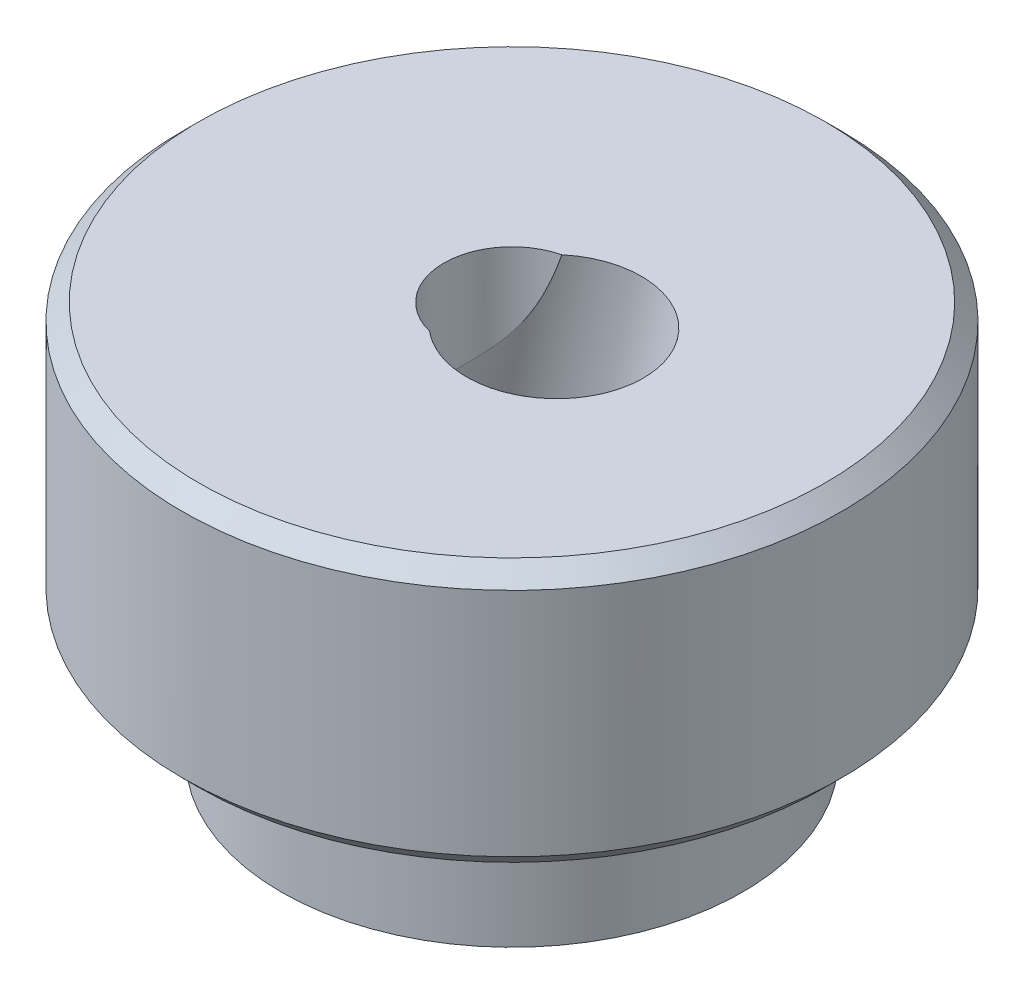
ISO-10303-21;
HEADER;
FILE_DESCRIPTION(('STEP AP214'),'2;1');
FILE_NAME('part.step','',(''),(''),'','','');
FILE_SCHEMA(('AUTOMOTIVE_DESIGN { 1 0 10303 214 1 1 1 1 }'));
ENDSEC;
DATA;
#1=APPLICATION_CONTEXT('core data for automotive mechanical design processes');
#2=APPLICATION_PROTOCOL_DEFINITION('international standard','automotive_design',2000,#1);
#3=PRODUCT_CONTEXT('',#1,'mechanical');
#4=PRODUCT('Part','Part','',(#3));
#5=PRODUCT_RELATED_PRODUCT_CATEGORY('part','',(#4));
#6=PRODUCT_DEFINITION_FORMATION('','',#4);
#7=PRODUCT_DEFINITION_CONTEXT('part definition',#1,'design');
#8=PRODUCT_DEFINITION('design','',#6,#7);
#9=PRODUCT_DEFINITION_SHAPE('','',#8);
#10=(LENGTH_UNIT() NAMED_UNIT(*) SI_UNIT(.MILLI.,.METRE.));
#11=(NAMED_UNIT(*) PLANE_ANGLE_UNIT() SI_UNIT($,.RADIAN.));
#12=(NAMED_UNIT(*) SI_UNIT($,.STERADIAN.) SOLID_ANGLE_UNIT());
#13=UNCERTAINTY_MEASURE_WITH_UNIT(LENGTH_MEASURE(1.E-05),#10,'distance_accuracy_value','');
#14=(GEOMETRIC_REPRESENTATION_CONTEXT(3) GLOBAL_UNCERTAINTY_ASSIGNED_CONTEXT((#13)) GLOBAL_UNIT_ASSIGNED_CONTEXT((#10,
#11,#12)) REPRESENTATION_CONTEXT('',''));
#15=CARTESIAN_POINT('',(0.,0.,0.));
#16=DIRECTION('',(0.,0.,1.));
#17=DIRECTION('',(1.,0.,0.));
#18=AXIS2_PLACEMENT_3D('',#15,#16,#17);
#19=CARTESIAN_POINT('',(7.00000000000014,0.,0.));
#20=DIRECTION('',(0.,1.,0.));
#21=DIRECTION('',(0.,0.,0.999999999999999));
#22=AXIS2_PLACEMENT_3D('',#19,#20,#21);
#23=PLANE('',#22);
#24=CARTESIAN_POINT('',(0.,0.,0.));
#25=DIRECTION('',(0.,-1.,0.));
#26=DIRECTION('',(0.,0.,-0.999999999999999));
#27=AXIS2_PLACEMENT_3D('',#24,#25,#26);
#28=CIRCLE('',#27,7.);
#29=CARTESIAN_POINT('',(0.,0.,-6.99999999999999));
#30=VERTEX_POINT('',#29);
#31=EDGE_CURVE('E48',#30,#30,#28,.F.);
#32=ORIENTED_EDGE('',*,*,#31,.F.);
#33=EDGE_LOOP('',(#32));
#34=FACE_BOUND('',#33,.T.);
#35=CARTESIAN_POINT('',(-1.27533937002003,0.,0.));
#36=DIRECTION('',(0.,1.,0.));
#37=DIRECTION('',(-1.,0.,0.));
#38=AXIS2_PLACEMENT_3D('',#35,#36,#37);
#39=ELLIPSE('',#38,2.70920257639233,2.65);
#40=CARTESIAN_POINT('',(0.493504047246851,0.,-2.0072226471797));
#41=VERTEX_POINT('',#40);
#42=CARTESIAN_POINT('',(0.493504047246768,0.,2.00722264717969));
#43=VERTEX_POINT('',#42);
#44=EDGE_CURVE('E42',#41,#43,#39,.T.);
#45=ORIENTED_EDGE('',*,*,#44,.T.);
#46=CARTESIAN_POINT('',(0.,0.,0.));
#47=DIRECTION('',(0.,-1.,0.));
#48=DIRECTION('',(0.,0.,-0.999999999999999));
#49=AXIS2_PLACEMENT_3D('',#46,#47,#48);
#50=CIRCLE('',#49,2.067);
#51=EDGE_CURVE('E19',#43,#41,#50,.F.);
#52=ORIENTED_EDGE('',*,*,#51,.T.);
#53=EDGE_LOOP('',(#45,#52));
#54=FACE_BOUND('',#53,.T.);
#55=ADVANCED_FACE('F16',(#34,#54),#23,.F.);
#56=CARTESIAN_POINT('',(0.,0.,0.));
#57=DIRECTION('',(0.,-1.,0.));
#58=DIRECTION('',(0.,0.,-0.999999999999999));
#59=AXIS2_PLACEMENT_3D('',#56,#57,#58);
#60=CYLINDRICAL_SURFACE('',#59,2.067);
#61=ORIENTED_EDGE('',*,*,#51,.F.);
#62=CARTESIAN_POINT('',(0.493504047246768,0.,2.00722264717969));
#63=CARTESIAN_POINT('',(0.517814431621046,0.0810077464212896,2.00123652872899));
#64=CARTESIAN_POINT('',(0.542731216709212,0.161797541343417,1.99465048664308));
#65=CARTESIAN_POINT('',(0.593931080497523,0.322843219694935,1.98001362872107));
#66=CARTESIAN_POINT('',(0.620214689850672,0.403098881906635,1.97196224090358));
#67=CARTESIAN_POINT('',(0.674571081727248,0.563766520293689,1.95403901411044));
#68=CARTESIAN_POINT('',(0.702659950013667,0.644171042963227,1.94414868414269));
#69=CARTESIAN_POINT('',(0.760527000887971,0.804073064003856,1.92225015042273));
#70=CARTESIAN_POINT('',(0.790304991198076,0.883570664380106,1.9102421874001));
#71=CARTESIAN_POINT('',(0.853152166971147,1.04512616149383,1.88304229241717));
#72=CARTESIAN_POINT('',(0.886310213484248,1.12712923342833,1.86772742876976));
#73=CARTESIAN_POINT('',(0.954810263405579,1.28948820673061,1.83365493324396));
#74=CARTESIAN_POINT('',(0.990151866670788,1.36984440631936,1.81489793091341));
#75=CARTESIAN_POINT('',(1.06296962145623,1.52806900085759,1.77322806723388));
#76=CARTESIAN_POINT('',(1.1004361116363,1.60594648129435,1.75033312049722));
#77=CARTESIAN_POINT('',(1.17759447283828,1.75883171356853,1.69938174516717));
#78=CARTESIAN_POINT('',(1.21728484424599,1.83384134318662,1.67132876631152));
#79=CARTESIAN_POINT('',(1.28732960200999,1.95977002673956,1.61760244082733));
#80=CARTESIAN_POINT('',(1.31721350844364,2.0115913563641,1.59343399672277));
#81=CARTESIAN_POINT('',(1.3778011995899,2.1128615352028,1.54134697348767));
#82=CARTESIAN_POINT('',(1.40850525965676,2.16230957163189,1.51342712187065));
#83=CARTESIAN_POINT('',(1.47008914423938,2.25787394367778,1.45366749180922));
#84=CARTESIAN_POINT('',(1.50096479634901,2.30401660318189,1.42186587940412));
#85=CARTESIAN_POINT('',(1.56264096353294,2.3928988117781,1.35379183499073));
#86=CARTESIAN_POINT('',(1.59344150267897,2.43563964596191,1.31752110458125));
#87=CARTESIAN_POINT('',(1.6697848124859,2.53788807513906,1.22057399865583));
#88=CARTESIAN_POINT('',(1.71488507657338,2.59491062185063,1.15684699353468));
#89=CARTESIAN_POINT('',(1.80055939828555,2.69825800852932,1.01837853988672));
#90=CARTESIAN_POINT('',(1.84112895760685,2.74457226475512,0.943626312851667));
#91=CARTESIAN_POINT('',(1.91461457630577,2.82537720679653,0.783899841426955));
#92=CARTESIAN_POINT('',(1.94748785933557,2.85980229207708,0.698872270371171));
#93=CARTESIAN_POINT('',(2.00231838598856,2.91580735185886,0.521368129268706));
#94=CARTESIAN_POINT('',(2.02427868666227,2.93739092398393,0.428893653765722));
#95=CARTESIAN_POINT('',(2.05372834983168,2.96603331229381,0.249268407003062));
#96=CARTESIAN_POINT('',(2.06244759565341,2.9743311915642,0.162513143474482));
#97=CARTESIAN_POINT('',(2.06880248854625,2.98039553696782,-0.0117525800647136));
#98=CARTESIAN_POINT('',(2.06644204960347,2.97816572209051,-0.0992627624916318));
#99=CARTESIAN_POINT('',(2.05108467757794,2.96343520226033,-0.269434877310985));
#100=CARTESIAN_POINT('',(2.03845088518638,2.95128509907768,-0.352160612769231));
#101=CARTESIAN_POINT('',(2.00389099673322,2.91719697876939,-0.513534547194752));
#102=CARTESIAN_POINT('',(1.98196587505401,2.89525998798264,-0.592183172758457));
#103=CARTESIAN_POINT('',(1.93003062701303,2.84145965397221,-0.74431986321158));
#104=CARTESIAN_POINT('',(1.89992608452563,2.80947966536885,-0.817734159532882));
#105=CARTESIAN_POINT('',(1.83382921440793,2.73619358439061,-0.956815747854895));
#106=CARTESIAN_POINT('',(1.7978357069073,2.6948856224988,-1.02248148286284));
#107=CARTESIAN_POINT('',(1.71951010497292,2.6005769710731,-1.14967460157953));
#108=CARTESIAN_POINT('',(1.67690856693421,2.54695024528161,-1.21056762086027));
#109=CARTESIAN_POINT('',(1.59009932733734,2.43154795276017,-1.32253628781858));
#110=CARTESIAN_POINT('',(1.54589208584962,2.36977470705424,-1.3736147216221));
#111=CARTESIAN_POINT('',(1.4645662435722,2.24974584960161,-1.45961558803388));
#112=CARTESIAN_POINT('',(1.4274052588299,2.19241555009703,-1.495814722832));
#113=CARTESIAN_POINT('',(1.35401222459217,2.07395922896829,-1.56256275323029));
#114=CARTESIAN_POINT('',(1.31778080657932,2.01283071878091,-1.59310789109901));
#115=CARTESIAN_POINT('',(1.24643381400083,1.88708088509039,-1.64953910611424));
#116=CARTESIAN_POINT('',(1.21133012794171,1.82243459396803,-1.6753840150992));
#117=CARTESIAN_POINT('',(1.14279440916476,1.69079928181279,-1.72285871721352));
#118=CARTESIAN_POINT('',(1.10936196706195,1.62381084140918,-1.74448954641513));
#119=CARTESIAN_POINT('',(1.01724586494026,1.43171892687444,-1.80072169990473));
#120=CARTESIAN_POINT('',(0.960587860906081,1.30444506566063,-1.83122304275174));
#121=CARTESIAN_POINT('',(0.852694575882828,1.04581309802964,-1.88387624920666));
#122=CARTESIAN_POINT('',(0.801468057745246,0.914448821075475,-1.90601476382392));
#123=CARTESIAN_POINT('',(0.705309610129638,0.653199158071962,-1.94360599695231));
#124=CARTESIAN_POINT('',(0.660232336912302,0.523392978599628,-1.95924374831698));
#125=CARTESIAN_POINT('',(0.595577050156639,0.327663362996737,-1.97946452987718));
#126=CARTESIAN_POINT('',(0.574553974215744,0.262368720909003,-1.98565721497309));
#127=CARTESIAN_POINT('',(0.53338869246199,0.131432791932095,-1.99710803660974));
#128=CARTESIAN_POINT('',(0.513246334625548,0.0657915670775251,-2.00236633492196));
#129=CARTESIAN_POINT('',(0.493504047246851,0.,-2.0072226471797));
#130=B_SPLINE_CURVE_WITH_KNOTS('',3,(#62,#63,#64,#65,#66,#67,#68,#69,#70,#71,#72,#73,#74,#75,
#76,#77,#78,#79,#80,#81,#82,#83,#84,#85,#86,#87,#88,#89,#90,#91,#92,#93,#94,#95,#96,#97,#98,#99,
#100,#101,#102,#103,#104,#105,#106,#107,#108,#109,#110,#111,#112,#113,#114,#115,#116,#117,#118,
#119,#120,#121,#122,#123,#124,#125,#126,#127,#128,#129),.UNSPECIFIED.,.F.,.F.,(4,2,2,2,2,2,2,2,
2,2,2,2,2,2,2,2,2,2,2,2,2,2,2,2,2,2,2,2,2,2,2,2,2,4),(0.,0.254372679933031,0.508844865197272,
0.76602970960853,1.02318533642769,1.29240360930047,1.56157269264756,1.82960320877049,
2.09745511148218,2.29087674107189,2.48436414616108,2.67608283638893,2.86772875475743,
3.15653415782304,3.4456237984502,3.7362839692038,4.02686267144659,4.28831449044216,
4.54967395647051,4.80217694598753,5.05465346204764,5.31017818092814,5.56575415772165,
5.83965614476514,6.11348026234247,6.34509993174506,6.57687299064379,6.81058742112475,
7.04424431793581,7.47146930553266,7.89937338906958,8.31408903598969,8.52070325669531,
8.72728167111558),.UNSPECIFIED.);
#131=EDGE_CURVE('E49',#43,#41,#130,.T.);
#132=ORIENTED_EDGE('',*,*,#131,.T.);
#133=EDGE_LOOP('',(#61,#132));
#134=FACE_BOUND('',#133,.T.);
#135=ADVANCED_FACE('F50',(#134),#60,.F.);
#136=CARTESIAN_POINT('',(0.,0.,0.));
#137=DIRECTION('',(0.,-1.,0.));
#138=DIRECTION('',(0.,0.,-0.999999999999999));
#139=AXIS2_PLACEMENT_3D('',#136,#137,#138);
#140=CYLINDRICAL_SURFACE('',#139,7.);
#141=CARTESIAN_POINT('',(1.38777878078145E-13,4.,0.));
#142=DIRECTION('',(0.,-1.,0.));
#143=DIRECTION('',(0.,0.,-0.999999999999999));
#144=AXIS2_PLACEMENT_3D('',#141,#142,#143);
#145=CIRCLE('',#144,7.);
#146=CARTESIAN_POINT('',(1.39555034195382E-13,4.00000000000002,-7.00000000000007));
#147=VERTEX_POINT('',#146);
#148=EDGE_CURVE('E147',#147,#147,#145,.T.);
#149=ORIENTED_EDGE('',*,*,#148,.T.);
#150=EDGE_LOOP('',(#149));
#151=FACE_BOUND('',#150,.T.);
#152=ORIENTED_EDGE('',*,*,#31,.T.);
#153=EDGE_LOOP('',(#152));
#154=FACE_BOUND('',#153,.T.);
#155=ADVANCED_FACE('F88',(#151,#154),#140,.T.);
#156=CARTESIAN_POINT('',(0.,0.,0.));
#157=DIRECTION('',(0.,-1.,0.));
#158=DIRECTION('',(0.,0.,-0.999999999999999));
#159=AXIS2_PLACEMENT_3D('',#156,#157,#158);
#160=CYLINDRICAL_SURFACE('',#159,2.067);
#161=CARTESIAN_POINT('',(-0.493504047246601,12.,2.0072226471796));
#162=CARTESIAN_POINT('',(-0.517814431620998,11.9189922535788,2.00123652872895));
#163=CARTESIAN_POINT('',(-0.542731216709213,11.8382024586567,1.99465048664305));
#164=CARTESIAN_POINT('',(-0.593931080497556,11.6771567803052,1.98001362872105));
#165=CARTESIAN_POINT('',(-0.62021468985069,11.5969011180935,1.97196224090356));
#166=CARTESIAN_POINT('',(-0.674571081727257,11.4362334797064,1.95403901411041));
#167=CARTESIAN_POINT('',(-0.702659950013682,11.3558289570369,1.94414868414267));
#168=CARTESIAN_POINT('',(-0.760527000887992,11.1959269359962,1.9222501504227));
#169=CARTESIAN_POINT('',(-0.790304991198096,11.11642933562,1.91024218740007));
#170=CARTESIAN_POINT('',(-0.853152166971173,10.9548738385063,1.88304229241714));
#171=CARTESIAN_POINT('',(-0.886310213484279,10.8728707665717,1.86772742876973));
#172=CARTESIAN_POINT('',(-0.954810263405613,10.7105117932694,1.83365493324393));
#173=CARTESIAN_POINT('',(-0.99015186667082,10.6301555936807,1.81489793091338));
#174=CARTESIAN_POINT('',(-1.06296962145628,10.4719309991425,1.77322806723384));
#175=CARTESIAN_POINT('',(-1.10043611163636,10.3940535187057,1.75033312049717));
#176=CARTESIAN_POINT('',(-1.1775944728383,10.2411682864315,1.69938174516713));
#177=CARTESIAN_POINT('',(-1.21728484424595,10.1661586568134,1.67132876631153));
#178=CARTESIAN_POINT('',(-1.28732960200996,10.0402299732605,1.61760244082733));
#179=CARTESIAN_POINT('',(-1.31721350844366,9.98840864363597,1.59343399672274));
#180=CARTESIAN_POINT('',(-1.37780119958994,9.8871384647973,1.54134697348763));
#181=CARTESIAN_POINT('',(-1.40850525965678,9.8376904283682,1.51342712187062));
#182=CARTESIAN_POINT('',(-1.47008914423941,9.74212605632233,1.45366749180919));
#183=CARTESIAN_POINT('',(-1.50096479634905,9.69598339681825,1.42186587940408));
#184=CARTESIAN_POINT('',(-1.56264096353293,9.60710118822198,1.35379183499072));
#185=CARTESIAN_POINT('',(-1.59344150267888,9.56436035403809,1.31752110458128));
#186=CARTESIAN_POINT('',(-1.66978481248577,9.46211192486091,1.22057399865588));
#187=CARTESIAN_POINT('',(-1.71488507657336,9.40508937814947,1.15684699353466));
#188=CARTESIAN_POINT('',(-1.8005593982856,9.3017419914708,1.01837853988668));
#189=CARTESIAN_POINT('',(-1.84112895760685,9.25542773524488,0.943626312851681));
#190=CARTESIAN_POINT('',(-1.91461457630576,9.17462279320348,0.783899841426996));
#191=CARTESIAN_POINT('',(-1.94748785933559,9.14019770792305,0.698872270371195));
#192=CARTESIAN_POINT('',(-2.00231838598852,9.08419264814127,0.521368129268753));
#193=CARTESIAN_POINT('',(-2.02427868666215,9.06260907601608,0.428893653765805));
#194=CARTESIAN_POINT('',(-2.05372834983159,9.03396668770621,0.24926840700316));
#195=CARTESIAN_POINT('',(-2.06244759565343,9.02566880843594,0.162513143474558));
#196=CARTESIAN_POINT('',(-2.06880248854624,9.01960446303227,-0.0117525800646855));
#197=CARTESIAN_POINT('',(-2.06644204960334,9.02183427790941,-0.099262762491629));
#198=CARTESIAN_POINT('',(-2.0510846775778,9.03656479773961,-0.269434877310986));
#199=CARTESIAN_POINT('',(-2.03845088518635,9.04871490092242,-0.352160612769213));
#200=CARTESIAN_POINT('',(-2.00389099673327,9.08280302123072,-0.513534547194739));
#201=CARTESIAN_POINT('',(-1.98196587505402,9.1047400120173,-0.59218317275847));
#202=CARTESIAN_POINT('',(-1.93003062701306,9.15854034602771,-0.744319863211583));
#203=CARTESIAN_POINT('',(-1.8999260845257,9.19052033463122,-0.817734159532846));
#204=CARTESIAN_POINT('',(-1.83382921440792,9.26380641560948,-0.956815747854839));
#205=CARTESIAN_POINT('',(-1.79783570690716,9.30511437750117,-1.0224814828628));
#206=CARTESIAN_POINT('',(-1.71951010497279,9.39942302892684,-1.1496746015795));
#207=CARTESIAN_POINT('',(-1.67690856693422,9.45304975471846,-1.21056762086024));
#208=CARTESIAN_POINT('',(-1.59009932733737,9.56845204723991,-1.32253628781857));
#209=CARTESIAN_POINT('',(-1.54589208584953,9.63022529294573,-1.37361472162211));
#210=CARTESIAN_POINT('',(-1.46456624357213,9.75025415039834,-1.45961558803388));
#211=CARTESIAN_POINT('',(-1.42740525882992,9.80758444990298,-1.49581472283198));
#212=CARTESIAN_POINT('',(-1.35401222459225,9.92604077103175,-1.56256275323025));
#213=CARTESIAN_POINT('',(-1.31778080657938,9.98716928121911,-1.59310789109897));
#214=CARTESIAN_POINT('',(-1.24643381400089,10.1129191149096,-1.64953910611422));
#215=CARTESIAN_POINT('',(-1.2113301279418,10.177565406032,-1.67538401509919));
#216=CARTESIAN_POINT('',(-1.14279440916479,10.3092007181872,-1.72285871721348));
#217=CARTESIAN_POINT('',(-1.10936196706189,10.3761891585908,-1.74448954641506));
#218=CARTESIAN_POINT('',(-1.01724586494011,10.5682810731255,-1.80072169990464));
#219=CARTESIAN_POINT('',(-0.960587860906076,10.6955549343393,-1.83122304275171));
#220=CARTESIAN_POINT('',(-0.852694575882916,10.9541869019704,-1.88387624920668));
#221=CARTESIAN_POINT('',(-0.801468057745289,11.0855511789246,-1.90601476382393));
#222=CARTESIAN_POINT('',(-0.705309610129637,11.3468008419281,-1.94360599695232));
#223=CARTESIAN_POINT('',(-0.660232336912302,11.4766070214004,-1.959243748317));
#224=CARTESIAN_POINT('',(-0.595577050156653,11.6723366370033,-1.9794645298772));
#225=CARTESIAN_POINT('',(-0.574553974215766,11.7376312790911,-1.9856572149731));
#226=CARTESIAN_POINT('',(-0.533388692461987,11.868567208068,-1.99710803660977));
#227=CARTESIAN_POINT('',(-0.513246334625513,11.9342084329225,-2.00236633492201));
#228=CARTESIAN_POINT('',(-0.49350404724674,12.,-2.0072226471798));
#229=B_SPLINE_CURVE_WITH_KNOTS('',3,(#161,#162,#163,#164,#165,#166,#167,#168,#169,#170,#171,
#172,#173,#174,#175,#176,#177,#178,#179,#180,#181,#182,#183,#184,#185,#186,#187,#188,#189,#190,
#191,#192,#193,#194,#195,#196,#197,#198,#199,#200,#201,#202,#203,#204,#205,#206,#207,#208,#209,
#210,#211,#212,#213,#214,#215,#216,#217,#218,#219,#220,#221,#222,#223,#224,#225,#226,#227,#228),
.UNSPECIFIED.,.F.,.F.,(4,2,2,2,2,2,2,2,2,2,2,2,2,2,2,2,2,2,2,2,2,2,2,2,2,2,2,2,2,2,2,2,2,4),(0.,
0.254372679933006,0.508844865197229,0.766029709608505,1.02318533642768,1.29240360930048,
1.5615726926476,1.82960320877053,2.09745511148221,2.29087674107189,2.48436414616107,
2.67608283638891,2.86772875475738,3.15653415782302,3.4456237984502,3.73628396920373,
4.02686267144645,4.28831449044209,4.5496739564705,4.8021769459875,5.05465346204757,
5.31017818092808,5.56575415772162,5.83965614476512,6.11348026234244,6.34509993174499,
6.5768729906437,6.81058742112465,7.04424431793569,7.47146930553258,7.89937338906955,
8.31408903598969,8.52070325669531,8.72728167111558),.UNSPECIFIED.);
#230=CARTESIAN_POINT('',(-0.493504047246601,12.,2.0072226471796));
#231=VERTEX_POINT('',#230);
#232=CARTESIAN_POINT('',(-0.49350404724674,12.,-2.0072226471798));
#233=VERTEX_POINT('',#232);
#234=EDGE_CURVE('E53',#231,#233,#229,.T.);
#235=ORIENTED_EDGE('',*,*,#234,.T.);
#236=CARTESIAN_POINT('',(1.38777878078145E-13,12.,0.));
#237=DIRECTION('',(0.,-1.,0.));
#238=DIRECTION('',(0.,0.,-0.999999999999999));
#239=AXIS2_PLACEMENT_3D('',#236,#237,#238);
#240=CIRCLE('',#239,2.067);
#241=EDGE_CURVE('E34',#233,#231,#240,.F.);
#242=ORIENTED_EDGE('',*,*,#241,.T.);
#243=EDGE_LOOP('',(#235,#242));
#244=FACE_BOUND('',#243,.T.);
#245=ADVANCED_FACE('F82',(#244),#160,.F.);
#246=CARTESIAN_POINT('',(-1.5593376811332,-1.33610700550352,0.));
#247=DIRECTION('',(-0.207911690817759,-0.978147600733806,0.));
#248=DIRECTION('',(0.978147600733806,-0.207911690817759,0.));
#249=AXIS2_PLACEMENT_3D('',#246,#247,#248);
#250=CYLINDRICAL_SURFACE('',#249,2.65);
#251=ORIENTED_EDGE('',*,*,#234,.F.);
#252=CARTESIAN_POINT('',(1.27533937002022,12.,0.));
#253=DIRECTION('',(0.,-1.,0.));
#254=DIRECTION('',(-1.,0.,0.));
#255=AXIS2_PLACEMENT_3D('',#252,#253,#254);
#256=ELLIPSE('',#255,2.70920257639233,2.65);
#257=EDGE_CURVE('E133',#231,#233,#256,.F.);
#258=ORIENTED_EDGE('',*,*,#257,.T.);
#259=EDGE_LOOP('',(#251,#258));
#260=FACE_BOUND('',#259,.T.);
#261=ORIENTED_EDGE('',*,*,#44,.F.);
#262=ORIENTED_EDGE('',*,*,#131,.F.);
#263=EDGE_LOOP('',(#261,#262));
#264=FACE_BOUND('',#263,.T.);
#265=ADVANCED_FACE('F55',(#260,#264),#250,.F.);
#266=CARTESIAN_POINT('',(9.50000000000001,4.00000000000001,0.));
#267=DIRECTION('',(0.,1.,0.));
#268=DIRECTION('',(0.,0.,0.999999999999999));
#269=AXIS2_PLACEMENT_3D('',#266,#267,#268);
#270=PLANE('',#269);
#271=CARTESIAN_POINT('',(1.38777878078145E-13,4.,0.));
#272=DIRECTION('',(0.,1.,0.));
#273=DIRECTION('',(0.,0.,0.999999999999999));
#274=AXIS2_PLACEMENT_3D('',#271,#272,#273);
#275=CIRCLE('',#274,9.5);
#276=CARTESIAN_POINT('',(1.37723166204751E-13,3.99999999999999,9.4999999999999));
#277=VERTEX_POINT('',#276);
#278=EDGE_CURVE('E125',#277,#277,#275,.T.);
#279=ORIENTED_EDGE('',*,*,#278,.F.);
#280=EDGE_LOOP('',(#279));
#281=FACE_BOUND('',#280,.T.);
#282=ORIENTED_EDGE('',*,*,#148,.F.);
#283=EDGE_LOOP('',(#282));
#284=FACE_BOUND('',#283,.T.);
#285=ADVANCED_FACE('F81',(#281,#284),#270,.F.);
#286=CARTESIAN_POINT('',(1.38777878078145E-13,12.,0.));
#287=DIRECTION('',(0.,-1.,0.));
#288=DIRECTION('',(0.,0.,-0.999999999999999));
#289=AXIS2_PLACEMENT_3D('',#286,#287,#288);
#290=PLANE('',#289);
#291=ORIENTED_EDGE('',*,*,#241,.F.);
#292=ORIENTED_EDGE('',*,*,#257,.F.);
#293=EDGE_LOOP('',(#291,#292));
#294=FACE_BOUND('',#293,.T.);
#295=CARTESIAN_POINT('',(1.38777878078145E-13,12.,0.));
#296=DIRECTION('',(0.,-1.,0.));
#297=DIRECTION('',(0.,0.,-0.999999999999999));
#298=AXIS2_PLACEMENT_3D('',#295,#296,#297);
#299=CIRCLE('',#298,9.5);
#300=CARTESIAN_POINT('',(1.39832589951538E-13,12.,-9.50000000000003));
#301=VERTEX_POINT('',#300);
#302=EDGE_CURVE('E123',#301,#301,#299,.T.);
#303=ORIENTED_EDGE('',*,*,#302,.F.);
#304=EDGE_LOOP('',(#303));
#305=FACE_BOUND('',#304,.T.);
#306=ADVANCED_FACE('F111',(#294,#305),#290,.F.);
#307=CARTESIAN_POINT('',(0.,4.50000000000001,0.));
#308=DIRECTION('',(0.,1.,0.));
#309=DIRECTION('',(0.,0.,0.999999999999999));
#310=AXIS2_PLACEMENT_3D('',#307,#308,#309);
#311=CONICAL_SURFACE('',#310,10.,0.785398163397447);
#312=CARTESIAN_POINT('',(1.11022302462516E-13,4.49999999999999,0.));
#313=DIRECTION('',(0.,-1.,0.));
#314=DIRECTION('',(0.,0.,-0.999999999999999));
#315=AXIS2_PLACEMENT_3D('',#312,#313,#314);
#316=CIRCLE('',#315,10.);
#317=CARTESIAN_POINT('',(1.12132525487141E-13,4.50000000000001,-10.));
#318=VERTEX_POINT('',#317);
#319=EDGE_CURVE('E26',#318,#318,#316,.F.);
#320=ORIENTED_EDGE('',*,*,#319,.F.);
#321=EDGE_LOOP('',(#320));
#322=FACE_BOUND('',#321,.T.);
#323=ORIENTED_EDGE('',*,*,#278,.T.);
#324=EDGE_LOOP('',(#323));
#325=FACE_BOUND('',#324,.T.);
#326=ADVANCED_FACE('F105',(#322,#325),#311,.T.);
#327=CARTESIAN_POINT('',(0.,11.5,0.));
#328=DIRECTION('',(0.,-1.,0.));
#329=DIRECTION('',(0.,0.,-0.999999999999999));
#330=AXIS2_PLACEMENT_3D('',#327,#328,#329);
#331=CONICAL_SURFACE('',#330,10.,0.785398163397448);
#332=ORIENTED_EDGE('',*,*,#302,.T.);
#333=EDGE_LOOP('',(#332));
#334=FACE_BOUND('',#333,.T.);
#335=CARTESIAN_POINT('',(0.,11.5,0.));
#336=DIRECTION('',(0.,-1.,0.));
#337=DIRECTION('',(0.,0.,-0.999999999999999));
#338=AXIS2_PLACEMENT_3D('',#335,#336,#337);
#339=CIRCLE('',#338,10.);
#340=CARTESIAN_POINT('',(0.,11.5,-10.));
#341=VERTEX_POINT('',#340);
#342=EDGE_CURVE('E11',#341,#341,#339,.T.);
#343=ORIENTED_EDGE('',*,*,#342,.F.);
#344=EDGE_LOOP('',(#343));
#345=FACE_BOUND('',#344,.T.);
#346=ADVANCED_FACE('F99',(#334,#345),#331,.T.);
#347=CARTESIAN_POINT('',(0.,0.,0.));
#348=DIRECTION('',(0.,-1.,0.));
#349=DIRECTION('',(0.,0.,-0.999999999999999));
#350=AXIS2_PLACEMENT_3D('',#347,#348,#349);
#351=CYLINDRICAL_SURFACE('',#350,10.);
#352=ORIENTED_EDGE('',*,*,#342,.T.);
#353=EDGE_LOOP('',(#352));
#354=FACE_BOUND('',#353,.T.);
#355=ORIENTED_EDGE('',*,*,#319,.T.);
#356=EDGE_LOOP('',(#355));
#357=FACE_BOUND('',#356,.T.);
#358=ADVANCED_FACE('F97',(#354,#357),#351,.T.);
#359=CLOSED_SHELL('',(#55,#135,#155,#245,#265,#285,#306,#326,#346,#358));
#360=MANIFOLD_SOLID_BREP('B1',#359);
#361=ADVANCED_BREP_SHAPE_REPRESENTATION('',(#18,#360),#14);
#362=SHAPE_DEFINITION_REPRESENTATION(#9,#361);
ENDSEC;
END-ISO-10303-21;
